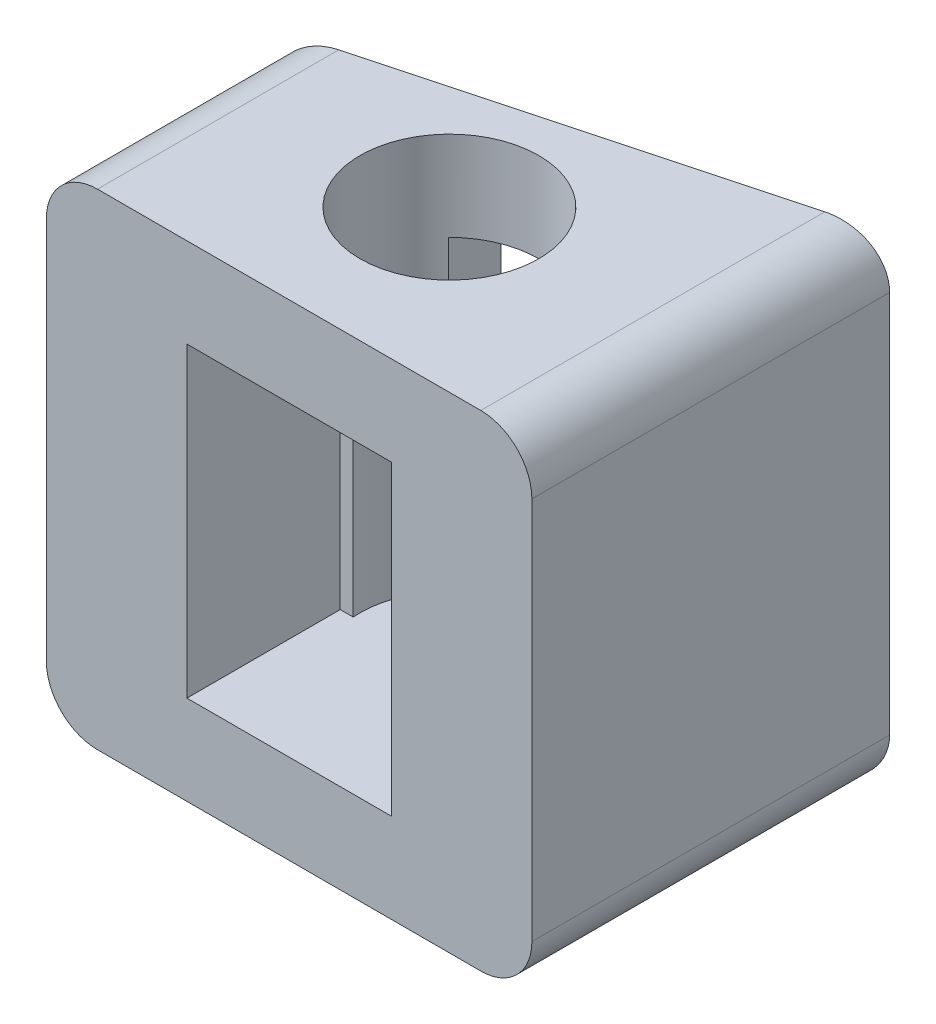
ISO-10303-21;
HEADER;
FILE_DESCRIPTION(('STEP AP214'),'2;1');
FILE_NAME('part.step','',(''),(''),'','','');
FILE_SCHEMA(('AUTOMOTIVE_DESIGN { 1 0 10303 214 1 1 1 1 }'));
ENDSEC;
DATA;
#1=APPLICATION_CONTEXT('core data for automotive mechanical design processes');
#2=APPLICATION_PROTOCOL_DEFINITION('international standard','automotive_design',2000,#1);
#3=PRODUCT_CONTEXT('',#1,'mechanical');
#4=PRODUCT('Part','Part','',(#3));
#5=PRODUCT_RELATED_PRODUCT_CATEGORY('part','',(#4));
#6=PRODUCT_DEFINITION_FORMATION('','',#4);
#7=PRODUCT_DEFINITION_CONTEXT('part definition',#1,'design');
#8=PRODUCT_DEFINITION('design','',#6,#7);
#9=PRODUCT_DEFINITION_SHAPE('','',#8);
#10=(LENGTH_UNIT() NAMED_UNIT(*) SI_UNIT(.MILLI.,.METRE.));
#11=(NAMED_UNIT(*) PLANE_ANGLE_UNIT() SI_UNIT($,.RADIAN.));
#12=(NAMED_UNIT(*) SI_UNIT($,.STERADIAN.) SOLID_ANGLE_UNIT());
#13=UNCERTAINTY_MEASURE_WITH_UNIT(LENGTH_MEASURE(1.E-05),#10,'distance_accuracy_value','');
#14=(GEOMETRIC_REPRESENTATION_CONTEXT(3) GLOBAL_UNCERTAINTY_ASSIGNED_CONTEXT((#13)) GLOBAL_UNIT_ASSIGNED_CONTEXT((#10,
#11,#12)) REPRESENTATION_CONTEXT('',''));
#15=CARTESIAN_POINT('',(0.,0.,0.));
#16=DIRECTION('',(0.,0.,1.));
#17=DIRECTION('',(1.,0.,0.));
#18=AXIS2_PLACEMENT_3D('',#15,#16,#17);
#19=CARTESIAN_POINT('',(1.25,3.,0.));
#20=DIRECTION('',(0.,1.,0.));
#21=DIRECTION('',(-1.,0.,0.));
#22=AXIS2_PLACEMENT_3D('',#19,#20,#21);
#23=PLANE('',#22);
#24=DIRECTION('',(-1.,0.,0.));
#25=VECTOR('',#24,1.);
#26=CARTESIAN_POINT('',(1.25,3.,7.));
#27=LINE('',#26,#25);
#28=CARTESIAN_POINT('',(2.,3.,7.));
#29=VERTEX_POINT('',#28);
#30=CARTESIAN_POINT('',(-2.,3.,7.));
#31=VERTEX_POINT('',#30);
#32=EDGE_CURVE('E235',#29,#31,#27,.T.);
#33=ORIENTED_EDGE('',*,*,#32,.T.);
#34=DIRECTION('',(0.,0.,1.));
#35=VECTOR('',#34,1.);
#36=CARTESIAN_POINT('',(-2.,3.,4.));
#37=LINE('',#36,#35);
#38=CARTESIAN_POINT('',(-2.,3.,4.));
#39=VERTEX_POINT('',#38);
#40=EDGE_CURVE('E176',#39,#31,#37,.T.);
#41=ORIENTED_EDGE('',*,*,#40,.F.);
#42=DIRECTION('',(-1.,0.,0.));
#43=VECTOR('',#42,1.);
#44=CARTESIAN_POINT('',(-2.,3.,4.));
#45=LINE('',#44,#43);
#46=CARTESIAN_POINT('',(-1.74675044883848,3.,4.));
#47=VERTEX_POINT('',#46);
#48=EDGE_CURVE('E183',#47,#39,#45,.T.);
#49=ORIENTED_EDGE('',*,*,#48,.F.);
#50=CARTESIAN_POINT('',(-0.00223587355044959,3.,3.86154821558523));
#51=DIRECTION('',(0.,1.,0.));
#52=DIRECTION('',(-1.,0.,0.));
#53=AXIS2_PLACEMENT_3D('',#50,#51,#52);
#54=CIRCLE('',#53,1.75);
#55=CARTESIAN_POINT('',(1.74227870173758,3.,4.));
#56=VERTEX_POINT('',#55);
#57=EDGE_CURVE('E55',#47,#56,#54,.T.);
#58=ORIENTED_EDGE('',*,*,#57,.T.);
#59=CARTESIAN_POINT('',(2.,3.,4.));
#60=VERTEX_POINT('',#59);
#61=EDGE_CURVE('E178',#60,#56,#45,.T.);
#62=ORIENTED_EDGE('',*,*,#61,.F.);
#63=DIRECTION('',(0.,0.,1.));
#64=VECTOR('',#63,1.);
#65=CARTESIAN_POINT('',(2.,3.,4.));
#66=LINE('',#65,#64);
#67=EDGE_CURVE('E168',#60,#29,#66,.T.);
#68=ORIENTED_EDGE('',*,*,#67,.T.);
#69=EDGE_LOOP('',(#33,#41,#49,#58,#62,#68));
#70=FACE_BOUND('',#69,.T.);
#71=ADVANCED_FACE('F39',(#70),#23,.F.);
#72=CARTESIAN_POINT('',(1.25,-3.,0.));
#73=DIRECTION('',(1.,0.,0.));
#74=DIRECTION('',(0.,1.,0.));
#75=AXIS2_PLACEMENT_3D('',#72,#73,#74);
#76=PLANE('',#75);
#77=DIRECTION('',(0.,0.,1.));
#78=VECTOR('',#77,1.);
#79=CARTESIAN_POINT('',(1.25,-3.,0.));
#80=LINE('',#79,#78);
#81=CARTESIAN_POINT('',(1.25,-3.,0.937822173508906));
#82=VERTEX_POINT('',#81);
#83=CARTESIAN_POINT('',(1.25,-3.,2.63908949767556));
#84=VERTEX_POINT('',#83);
#85=EDGE_CURVE('E248',#82,#84,#80,.T.);
#86=ORIENTED_EDGE('',*,*,#85,.T.);
#87=DIRECTION('',(0.,1.,0.));
#88=VECTOR('',#87,1.);
#89=CARTESIAN_POINT('',(1.25,-7.94974746830584,2.63908949767556));
#90=LINE('',#89,#88);
#91=CARTESIAN_POINT('',(1.25,3.,2.63908949767556));
#92=VERTEX_POINT('',#91);
#93=EDGE_CURVE('E223',#84,#92,#90,.T.);
#94=ORIENTED_EDGE('',*,*,#93,.T.);
#95=DIRECTION('',(0.,0.,1.));
#96=VECTOR('',#95,1.);
#97=CARTESIAN_POINT('',(1.25,3.,0.));
#98=LINE('',#97,#96);
#99=CARTESIAN_POINT('',(1.25,3.,0.937822173508905));
#100=VERTEX_POINT('',#99);
#101=EDGE_CURVE('E244',#100,#92,#98,.T.);
#102=ORIENTED_EDGE('',*,*,#101,.F.);
#103=DIRECTION('',(0.,1.,0.));
#104=VECTOR('',#103,1.);
#105=CARTESIAN_POINT('',(1.25,-5.,0.937822173508905));
#106=LINE('',#105,#104);
#107=EDGE_CURVE('E258',#82,#100,#106,.T.);
#108=ORIENTED_EDGE('',*,*,#107,.F.);
#109=EDGE_LOOP('',(#86,#94,#102,#108));
#110=FACE_BOUND('',#109,.T.);
#111=ADVANCED_FACE('F383',(#110),#76,.F.);
#112=CARTESIAN_POINT('',(3.75,3.75,10.));
#113=DIRECTION('',(0.,0.,-1.));
#114=DIRECTION('',(-1.,0.,0.));
#115=AXIS2_PLACEMENT_3D('',#112,#113,#114);
#116=CYLINDRICAL_SURFACE('',#115,1.);
#117=DIRECTION('',(0.,0.,-1.));
#118=VECTOR('',#117,1.);
#119=CARTESIAN_POINT('',(3.74999999999999,4.75,10.));
#120=LINE('',#119,#118);
#121=CARTESIAN_POINT('',(3.74999999999999,4.75,7.));
#122=VERTEX_POINT('',#121);
#123=CARTESIAN_POINT('',(3.74999999999999,4.75,0.267949192431118));
#124=VERTEX_POINT('',#123);
#125=EDGE_CURVE('E353',#122,#124,#120,.T.);
#126=ORIENTED_EDGE('',*,*,#125,.F.);
#127=CARTESIAN_POINT('',(3.75,3.75,7.));
#128=DIRECTION('',(0.,0.,-1.));
#129=DIRECTION('',(-1.,0.,0.));
#130=AXIS2_PLACEMENT_3D('',#127,#128,#129);
#131=CIRCLE('',#130,1.);
#132=CARTESIAN_POINT('',(4.75,3.74999999999999,7.));
#133=VERTEX_POINT('',#132);
#134=EDGE_CURVE('E296',#122,#133,#131,.T.);
#135=ORIENTED_EDGE('',*,*,#134,.T.);
#136=DIRECTION('',(0.,0.,-1.));
#137=VECTOR('',#136,1.);
#138=CARTESIAN_POINT('',(4.75,3.74999999999999,10.));
#139=LINE('',#138,#137);
#140=CARTESIAN_POINT('',(4.75,3.74999999999999,0.));
#141=VERTEX_POINT('',#140);
#142=EDGE_CURVE('E332',#133,#141,#139,.T.);
#143=ORIENTED_EDGE('',*,*,#142,.T.);
#144=CARTESIAN_POINT('',(3.75,3.75,0.267949192431116));
#145=DIRECTION('',(0.258819045102515,0.,0.96592582628907));
#146=DIRECTION('',(0.96592582628907,0.,-0.258819045102515));
#147=AXIS2_PLACEMENT_3D('',#144,#145,#146);
#148=ELLIPSE('',#147,1.03527618041008,1.);
#149=EDGE_CURVE('E324',#141,#124,#148,.T.);
#150=ORIENTED_EDGE('',*,*,#149,.T.);
#151=EDGE_LOOP('',(#126,#135,#143,#150));
#152=FACE_BOUND('',#151,.T.);
#153=ADVANCED_FACE('F41',(#152),#116,.T.);
#154=CARTESIAN_POINT('',(-3.75,4.75,10.));
#155=DIRECTION('',(0.,-1.,0.));
#156=DIRECTION('',(0.,0.,-1.));
#157=AXIS2_PLACEMENT_3D('',#154,#155,#156);
#158=PLANE('',#157);
#159=CARTESIAN_POINT('',(-0.00223587355044959,4.75,3.86154821558523));
#160=DIRECTION('',(0.,1.,0.));
#161=DIRECTION('',(0.,0.,1.));
#162=AXIS2_PLACEMENT_3D('',#159,#160,#161);
#163=CIRCLE('',#162,1.75);
#164=CARTESIAN_POINT('',(-0.00223587355044959,4.75,5.61154821558523));
#165=VERTEX_POINT('',#164);
#166=EDGE_CURVE('E206',#165,#165,#163,.T.);
#167=ORIENTED_EDGE('',*,*,#166,.F.);
#168=EDGE_LOOP('',(#167));
#169=FACE_BOUND('',#168,.T.);
#170=DIRECTION('',(0.,0.,-1.));
#171=VECTOR('',#170,1.);
#172=CARTESIAN_POINT('',(-3.75,4.75,10.));
#173=LINE('',#172,#171);
#174=CARTESIAN_POINT('',(-3.75,4.75,7.));
#175=VERTEX_POINT('',#174);
#176=CARTESIAN_POINT('',(-3.75,4.75,2.27756813566448));
#177=VERTEX_POINT('',#176);
#178=EDGE_CURVE('E350',#175,#177,#173,.T.);
#179=ORIENTED_EDGE('',*,*,#178,.F.);
#180=DIRECTION('',(-1.,0.,0.));
#181=VECTOR('',#180,1.);
#182=CARTESIAN_POINT('',(-4.75,4.75,7.));
#183=LINE('',#182,#181);
#184=EDGE_CURVE('E270',#122,#175,#183,.T.);
#185=ORIENTED_EDGE('',*,*,#184,.F.);
#186=ORIENTED_EDGE('',*,*,#125,.T.);
#187=DIRECTION('',(-0.96592582628907,0.,0.258819045102515));
#188=VECTOR('',#187,1.);
#189=CARTESIAN_POINT('',(-5.68060796608383,4.75,2.79487298107773));
#190=LINE('',#189,#188);
#191=EDGE_CURVE('E320',#124,#177,#190,.T.);
#192=ORIENTED_EDGE('',*,*,#191,.T.);
#193=EDGE_LOOP('',(#179,#185,#186,#192));
#194=FACE_BOUND('',#193,.T.);
#195=ADVANCED_FACE('F399',(#169,#194),#158,.F.);
#196=CARTESIAN_POINT('',(-3.75,3.75,10.));
#197=DIRECTION('',(0.,0.,-1.));
#198=DIRECTION('',(-1.,0.,0.));
#199=AXIS2_PLACEMENT_3D('',#196,#197,#198);
#200=CYLINDRICAL_SURFACE('',#199,1.);
#201=DIRECTION('',(0.,0.,-1.));
#202=VECTOR('',#201,1.);
#203=CARTESIAN_POINT('',(-4.75,3.74999999999999,10.));
#204=LINE('',#203,#202);
#205=CARTESIAN_POINT('',(-4.75,3.74999999999999,7.));
#206=VERTEX_POINT('',#205);
#207=CARTESIAN_POINT('',(-4.75,3.74999999999999,2.5455173280956));
#208=VERTEX_POINT('',#207);
#209=EDGE_CURVE('E347',#206,#208,#204,.T.);
#210=ORIENTED_EDGE('',*,*,#209,.F.);
#211=CARTESIAN_POINT('',(-3.75,3.75,7.));
#212=DIRECTION('',(0.,0.,-1.));
#213=DIRECTION('',(-1.,0.,0.));
#214=AXIS2_PLACEMENT_3D('',#211,#212,#213);
#215=CIRCLE('',#214,1.);
#216=EDGE_CURVE('E292',#206,#175,#215,.T.);
#217=ORIENTED_EDGE('',*,*,#216,.T.);
#218=ORIENTED_EDGE('',*,*,#178,.T.);
#219=CARTESIAN_POINT('',(-3.75,3.75,2.27756813566449));
#220=DIRECTION('',(0.258819045102515,0.,0.96592582628907));
#221=DIRECTION('',(0.96592582628907,0.,-0.258819045102515));
#222=AXIS2_PLACEMENT_3D('',#219,#220,#221);
#223=ELLIPSE('',#222,1.03527618041008,1.);
#224=EDGE_CURVE('E316',#177,#208,#223,.T.);
#225=ORIENTED_EDGE('',*,*,#224,.T.);
#226=EDGE_LOOP('',(#210,#217,#218,#225));
#227=FACE_BOUND('',#226,.T.);
#228=ADVANCED_FACE('F397',(#227),#200,.T.);
#229=CARTESIAN_POINT('',(-4.75,3.74999999999999,10.));
#230=DIRECTION('',(1.,0.,0.));
#231=DIRECTION('',(0.,1.,0.));
#232=AXIS2_PLACEMENT_3D('',#229,#230,#231);
#233=PLANE('',#232);
#234=DIRECTION('',(0.,0.,-1.));
#235=VECTOR('',#234,1.);
#236=CARTESIAN_POINT('',(-4.75,-3.74999999999999,10.));
#237=LINE('',#236,#235);
#238=CARTESIAN_POINT('',(-4.75,-3.75,7.));
#239=VERTEX_POINT('',#238);
#240=CARTESIAN_POINT('',(-4.75,-3.75,2.5455173280956));
#241=VERTEX_POINT('',#240);
#242=EDGE_CURVE('E344',#239,#241,#237,.T.);
#243=ORIENTED_EDGE('',*,*,#242,.F.);
#244=DIRECTION('',(0.,1.,0.));
#245=VECTOR('',#244,1.);
#246=CARTESIAN_POINT('',(-4.75,-4.75,7.));
#247=LINE('',#246,#245);
#248=EDGE_CURVE('E278',#239,#206,#247,.T.);
#249=ORIENTED_EDGE('',*,*,#248,.T.);
#250=ORIENTED_EDGE('',*,*,#209,.T.);
#251=DIRECTION('',(0.,1.,0.));
#252=VECTOR('',#251,1.);
#253=CARTESIAN_POINT('',(-4.75,-5.,2.5455173280956));
#254=LINE('',#253,#252);
#255=EDGE_CURVE('E300',#241,#208,#254,.T.);
#256=ORIENTED_EDGE('',*,*,#255,.F.);
#257=EDGE_LOOP('',(#243,#249,#250,#256));
#258=FACE_BOUND('',#257,.T.);
#259=ADVANCED_FACE('F423',(#258),#233,.F.);
#260=CARTESIAN_POINT('',(-3.75,-3.75,10.));
#261=DIRECTION('',(0.,0.,-1.));
#262=DIRECTION('',(-1.,0.,0.));
#263=AXIS2_PLACEMENT_3D('',#260,#261,#262);
#264=CYLINDRICAL_SURFACE('',#263,1.);
#265=DIRECTION('',(0.,0.,-1.));
#266=VECTOR('',#265,1.);
#267=CARTESIAN_POINT('',(-3.74999999999999,-4.75,10.));
#268=LINE('',#267,#266);
#269=CARTESIAN_POINT('',(-3.74999999999999,-4.75,7.));
#270=VERTEX_POINT('',#269);
#271=CARTESIAN_POINT('',(-3.74999999999999,-4.75,2.27756813566448));
#272=VERTEX_POINT('',#271);
#273=EDGE_CURVE('E341',#270,#272,#268,.T.);
#274=ORIENTED_EDGE('',*,*,#273,.F.);
#275=CARTESIAN_POINT('',(-3.75,-3.75,7.));
#276=DIRECTION('',(0.,0.,-1.));
#277=DIRECTION('',(-1.,0.,0.));
#278=AXIS2_PLACEMENT_3D('',#275,#276,#277);
#279=CIRCLE('',#278,1.);
#280=EDGE_CURVE('E288',#270,#239,#279,.T.);
#281=ORIENTED_EDGE('',*,*,#280,.T.);
#282=ORIENTED_EDGE('',*,*,#242,.T.);
#283=CARTESIAN_POINT('',(-3.75,-3.75,2.27756813566449));
#284=DIRECTION('',(0.258819045102515,0.,0.96592582628907));
#285=DIRECTION('',(0.96592582628907,0.,-0.258819045102515));
#286=AXIS2_PLACEMENT_3D('',#283,#284,#285);
#287=ELLIPSE('',#286,1.03527618041008,1.);
#288=EDGE_CURVE('E312',#241,#272,#287,.T.);
#289=ORIENTED_EDGE('',*,*,#288,.T.);
#290=EDGE_LOOP('',(#274,#281,#282,#289));
#291=FACE_BOUND('',#290,.T.);
#292=ADVANCED_FACE('F420',(#291),#264,.T.);
#293=CARTESIAN_POINT('',(-3.74999999999999,-4.75,10.));
#294=DIRECTION('',(0.,1.,0.));
#295=DIRECTION('',(0.,0.,1.));
#296=AXIS2_PLACEMENT_3D('',#293,#294,#295);
#297=PLANE('',#296);
#298=DIRECTION('',(0.,0.,-1.));
#299=VECTOR('',#298,1.);
#300=CARTESIAN_POINT('',(3.74999999999999,-4.75,10.));
#301=LINE('',#300,#299);
#302=CARTESIAN_POINT('',(3.75,-4.75,7.));
#303=VERTEX_POINT('',#302);
#304=CARTESIAN_POINT('',(3.74999999999999,-4.75,0.267949192431118));
#305=VERTEX_POINT('',#304);
#306=EDGE_CURVE('E338',#303,#305,#301,.T.);
#307=ORIENTED_EDGE('',*,*,#306,.F.);
#308=DIRECTION('',(-1.,0.,0.));
#309=VECTOR('',#308,1.);
#310=CARTESIAN_POINT('',(-4.75,-4.75,7.));
#311=LINE('',#310,#309);
#312=EDGE_CURVE('E271',#303,#270,#311,.T.);
#313=ORIENTED_EDGE('',*,*,#312,.T.);
#314=ORIENTED_EDGE('',*,*,#273,.T.);
#315=DIRECTION('',(0.96592582628907,0.,-0.258819045102515));
#316=VECTOR('',#315,1.);
#317=CARTESIAN_POINT('',(-5.68060796608383,-4.75,2.79487298107773));
#318=LINE('',#317,#316);
#319=EDGE_CURVE('E308',#272,#305,#318,.T.);
#320=ORIENTED_EDGE('',*,*,#319,.T.);
#321=EDGE_LOOP('',(#307,#313,#314,#320));
#322=FACE_BOUND('',#321,.T.);
#323=ADVANCED_FACE('F415',(#322),#297,.F.);
#324=CARTESIAN_POINT('',(3.75,-3.75,10.));
#325=DIRECTION('',(0.,0.,-1.));
#326=DIRECTION('',(-1.,0.,0.));
#327=AXIS2_PLACEMENT_3D('',#324,#325,#326);
#328=CYLINDRICAL_SURFACE('',#327,1.);
#329=DIRECTION('',(0.,0.,-1.));
#330=VECTOR('',#329,1.);
#331=CARTESIAN_POINT('',(4.75,-3.74999999999999,10.));
#332=LINE('',#331,#330);
#333=CARTESIAN_POINT('',(4.75,-3.74999999999999,7.));
#334=VERTEX_POINT('',#333);
#335=CARTESIAN_POINT('',(4.75,-3.74999999999999,0.));
#336=VERTEX_POINT('',#335);
#337=EDGE_CURVE('E335',#334,#336,#332,.T.);
#338=ORIENTED_EDGE('',*,*,#337,.F.);
#339=CARTESIAN_POINT('',(3.75,-3.75,7.));
#340=DIRECTION('',(0.,0.,-1.));
#341=DIRECTION('',(-1.,0.,0.));
#342=AXIS2_PLACEMENT_3D('',#339,#340,#341);
#343=CIRCLE('',#342,1.);
#344=EDGE_CURVE('E282',#334,#303,#343,.T.);
#345=ORIENTED_EDGE('',*,*,#344,.T.);
#346=ORIENTED_EDGE('',*,*,#306,.T.);
#347=CARTESIAN_POINT('',(3.75,-3.75,0.267949192431116));
#348=DIRECTION('',(0.258819045102515,0.,0.96592582628907));
#349=DIRECTION('',(0.96592582628907,0.,-0.258819045102515));
#350=AXIS2_PLACEMENT_3D('',#347,#348,#349);
#351=ELLIPSE('',#350,1.03527618041008,1.);
#352=EDGE_CURVE('E304',#305,#336,#351,.T.);
#353=ORIENTED_EDGE('',*,*,#352,.T.);
#354=EDGE_LOOP('',(#338,#345,#346,#353));
#355=FACE_BOUND('',#354,.T.);
#356=ADVANCED_FACE('F412',(#355),#328,.T.);
#357=CARTESIAN_POINT('',(4.75,3.74999999999999,10.));
#358=DIRECTION('',(-1.,0.,0.));
#359=DIRECTION('',(0.,-1.,0.));
#360=AXIS2_PLACEMENT_3D('',#357,#358,#359);
#361=PLANE('',#360);
#362=ORIENTED_EDGE('',*,*,#142,.F.);
#363=DIRECTION('',(0.,1.,0.));
#364=VECTOR('',#363,1.);
#365=CARTESIAN_POINT('',(4.75,-4.75,7.));
#366=LINE('',#365,#364);
#367=EDGE_CURVE('E275',#334,#133,#366,.T.);
#368=ORIENTED_EDGE('',*,*,#367,.F.);
#369=ORIENTED_EDGE('',*,*,#337,.T.);
#370=DIRECTION('',(0.,1.,0.));
#371=VECTOR('',#370,1.);
#372=CARTESIAN_POINT('',(4.75,3.74999999999999,0.));
#373=LINE('',#372,#371);
#374=EDGE_CURVE('E328',#336,#141,#373,.T.);
#375=ORIENTED_EDGE('',*,*,#374,.T.);
#376=EDGE_LOOP('',(#362,#368,#369,#375));
#377=FACE_BOUND('',#376,.T.);
#378=ADVANCED_FACE('F407',(#377),#361,.F.);
#379=CARTESIAN_POINT('',(-4.75,-5.,2.5455173280956));
#380=DIRECTION('',(0.258819045102515,0.,0.96592582628907));
#381=DIRECTION('',(0.96592582628907,0.,-0.258819045102515));
#382=AXIS2_PLACEMENT_3D('',#379,#380,#381);
#383=PLANE('',#382);
#384=DIRECTION('',(-0.96592582628907,0.,0.258819045102515));
#385=VECTOR('',#384,1.);
#386=CARTESIAN_POINT('',(-4.75000000000001,3.,2.5455173280956));
#387=LINE('',#386,#385);
#388=CARTESIAN_POINT('',(-1.25,3.,1.6076951545867));
#389=VERTEX_POINT('',#388);
#390=EDGE_CURVE('E262',#100,#389,#387,.T.);
#391=ORIENTED_EDGE('',*,*,#390,.T.);
#392=DIRECTION('',(0.,-1.,0.));
#393=VECTOR('',#392,1.);
#394=CARTESIAN_POINT('',(-1.25,-5.,1.6076951545867));
#395=LINE('',#394,#393);
#396=CARTESIAN_POINT('',(-1.25,-3.,1.6076951545867));
#397=VERTEX_POINT('',#396);
#398=EDGE_CURVE('E266',#389,#397,#395,.T.);
#399=ORIENTED_EDGE('',*,*,#398,.T.);
#400=DIRECTION('',(0.96592582628907,0.,-0.258819045102515));
#401=VECTOR('',#400,1.);
#402=CARTESIAN_POINT('',(-4.75,-3.,2.5455173280956));
#403=LINE('',#402,#401);
#404=EDGE_CURVE('E243',#397,#82,#403,.T.);
#405=ORIENTED_EDGE('',*,*,#404,.T.);
#406=ORIENTED_EDGE('',*,*,#107,.T.);
#407=EDGE_LOOP('',(#391,#399,#405,#406));
#408=FACE_BOUND('',#407,.T.);
#409=ORIENTED_EDGE('',*,*,#374,.F.);
#410=ORIENTED_EDGE('',*,*,#352,.F.);
#411=ORIENTED_EDGE('',*,*,#319,.F.);
#412=ORIENTED_EDGE('',*,*,#288,.F.);
#413=ORIENTED_EDGE('',*,*,#255,.T.);
#414=ORIENTED_EDGE('',*,*,#224,.F.);
#415=ORIENTED_EDGE('',*,*,#191,.F.);
#416=ORIENTED_EDGE('',*,*,#149,.F.);
#417=EDGE_LOOP('',(#409,#410,#411,#412,#413,#414,#415,#416));
#418=FACE_BOUND('',#417,.T.);
#419=ADVANCED_FACE('F379',(#408,#418),#383,.F.);
#420=CARTESIAN_POINT('',(-4.75,-4.75,7.));
#421=DIRECTION('',(0.,0.,-1.));
#422=DIRECTION('',(-1.,0.,0.));
#423=AXIS2_PLACEMENT_3D('',#420,#421,#422);
#424=PLANE('',#423);
#425=DIRECTION('',(1.,0.,0.));
#426=VECTOR('',#425,1.);
#427=CARTESIAN_POINT('',(1.25,-3.,7.));
#428=LINE('',#427,#426);
#429=CARTESIAN_POINT('',(-2.,-3.,7.));
#430=VERTEX_POINT('',#429);
#431=CARTESIAN_POINT('',(2.,-3.,7.));
#432=VERTEX_POINT('',#431);
#433=EDGE_CURVE('E232',#430,#432,#428,.T.);
#434=ORIENTED_EDGE('',*,*,#433,.F.);
#435=DIRECTION('',(0.,-1.,0.));
#436=VECTOR('',#435,1.);
#437=CARTESIAN_POINT('',(-2.,3.,7.));
#438=LINE('',#437,#436);
#439=EDGE_CURVE('E190',#31,#430,#438,.T.);
#440=ORIENTED_EDGE('',*,*,#439,.F.);
#441=ORIENTED_EDGE('',*,*,#32,.F.);
#442=DIRECTION('',(0.,1.,0.));
#443=VECTOR('',#442,1.);
#444=CARTESIAN_POINT('',(2.,3.,7.));
#445=LINE('',#444,#443);
#446=EDGE_CURVE('E174',#432,#29,#445,.T.);
#447=ORIENTED_EDGE('',*,*,#446,.F.);
#448=EDGE_LOOP('',(#434,#440,#441,#447));
#449=FACE_BOUND('',#448,.T.);
#450=ORIENTED_EDGE('',*,*,#184,.T.);
#451=ORIENTED_EDGE('',*,*,#216,.F.);
#452=ORIENTED_EDGE('',*,*,#248,.F.);
#453=ORIENTED_EDGE('',*,*,#280,.F.);
#454=ORIENTED_EDGE('',*,*,#312,.F.);
#455=ORIENTED_EDGE('',*,*,#344,.F.);
#456=ORIENTED_EDGE('',*,*,#367,.T.);
#457=ORIENTED_EDGE('',*,*,#134,.F.);
#458=EDGE_LOOP('',(#450,#451,#452,#453,#454,#455,#456,#457));
#459=FACE_BOUND('',#458,.T.);
#460=ADVANCED_FACE('F387',(#449,#459),#424,.F.);
#461=CARTESIAN_POINT('',(-1.25,-3.,0.));
#462=DIRECTION('',(-1.,0.,0.));
#463=DIRECTION('',(0.,0.,1.));
#464=AXIS2_PLACEMENT_3D('',#461,#462,#463);
#465=PLANE('',#464);
#466=DIRECTION('',(0.,0.,1.));
#467=VECTOR('',#466,1.);
#468=CARTESIAN_POINT('',(-1.25,3.,0.));
#469=LINE('',#468,#467);
#470=CARTESIAN_POINT('',(-1.25,3.,2.63452552437467));
#471=VERTEX_POINT('',#470);
#472=EDGE_CURVE('E239',#389,#471,#469,.T.);
#473=ORIENTED_EDGE('',*,*,#472,.T.);
#474=DIRECTION('',(0.,1.,0.));
#475=VECTOR('',#474,1.);
#476=CARTESIAN_POINT('',(-1.25,-7.94974746830584,2.63452552437467));
#477=LINE('',#476,#475);
#478=CARTESIAN_POINT('',(-1.25,-3.,2.63452552437467));
#479=VERTEX_POINT('',#478);
#480=EDGE_CURVE('E228',#471,#479,#477,.F.);
#481=ORIENTED_EDGE('',*,*,#480,.T.);
#482=DIRECTION('',(0.,0.,1.));
#483=VECTOR('',#482,1.);
#484=CARTESIAN_POINT('',(-1.25,-3.,0.));
#485=LINE('',#484,#483);
#486=EDGE_CURVE('E238',#397,#479,#485,.T.);
#487=ORIENTED_EDGE('',*,*,#486,.F.);
#488=ORIENTED_EDGE('',*,*,#398,.F.);
#489=EDGE_LOOP('',(#473,#481,#487,#488));
#490=FACE_BOUND('',#489,.T.);
#491=ADVANCED_FACE('F377',(#490),#465,.F.);
#492=ORIENTED_EDGE('',*,*,#101,.T.);
#493=EDGE_CURVE('E224',#92,#471,#54,.T.);
#494=ORIENTED_EDGE('',*,*,#493,.T.);
#495=ORIENTED_EDGE('',*,*,#472,.F.);
#496=ORIENTED_EDGE('',*,*,#390,.F.);
#497=EDGE_LOOP('',(#492,#494,#495,#496));
#498=FACE_BOUND('',#497,.T.);
#499=ADVANCED_FACE('F373',(#498),#23,.F.);
#500=CARTESIAN_POINT('',(1.25,-3.,0.));
#501=DIRECTION('',(0.,-1.,0.));
#502=DIRECTION('',(1.,0.,0.));
#503=AXIS2_PLACEMENT_3D('',#500,#501,#502);
#504=PLANE('',#503);
#505=DIRECTION('',(0.,0.,1.));
#506=VECTOR('',#505,1.);
#507=CARTESIAN_POINT('',(-2.,-3.,4.));
#508=LINE('',#507,#506);
#509=CARTESIAN_POINT('',(-2.,-3.,4.));
#510=VERTEX_POINT('',#509);
#511=EDGE_CURVE('E207',#510,#430,#508,.T.);
#512=ORIENTED_EDGE('',*,*,#511,.T.);
#513=ORIENTED_EDGE('',*,*,#433,.T.);
#514=DIRECTION('',(0.,0.,1.));
#515=VECTOR('',#514,1.);
#516=CARTESIAN_POINT('',(2.,-3.,4.));
#517=LINE('',#516,#515);
#518=CARTESIAN_POINT('',(2.,-3.,4.));
#519=VERTEX_POINT('',#518);
#520=EDGE_CURVE('E203',#519,#432,#517,.T.);
#521=ORIENTED_EDGE('',*,*,#520,.F.);
#522=DIRECTION('',(1.,0.,0.));
#523=VECTOR('',#522,1.);
#524=CARTESIAN_POINT('',(-2.,-3.,4.));
#525=LINE('',#524,#523);
#526=CARTESIAN_POINT('',(1.74227870173758,-3.,4.));
#527=VERTEX_POINT('',#526);
#528=EDGE_CURVE('E187',#527,#519,#525,.T.);
#529=ORIENTED_EDGE('',*,*,#528,.F.);
#530=CARTESIAN_POINT('',(-0.00223587355044959,-3.,3.86154821558523));
#531=DIRECTION('',(0.,-1.,0.));
#532=DIRECTION('',(1.,0.,0.));
#533=AXIS2_PLACEMENT_3D('',#530,#531,#532);
#534=CIRCLE('',#533,1.75);
#535=EDGE_CURVE('E217',#527,#84,#534,.F.);
#536=ORIENTED_EDGE('',*,*,#535,.T.);
#537=ORIENTED_EDGE('',*,*,#85,.F.);
#538=ORIENTED_EDGE('',*,*,#404,.F.);
#539=ORIENTED_EDGE('',*,*,#486,.T.);
#540=CARTESIAN_POINT('',(-1.74675044883848,-3.,4.));
#541=VERTEX_POINT('',#540);
#542=EDGE_CURVE('E220',#479,#541,#534,.F.);
#543=ORIENTED_EDGE('',*,*,#542,.T.);
#544=EDGE_CURVE('E63',#510,#541,#525,.T.);
#545=ORIENTED_EDGE('',*,*,#544,.F.);
#546=EDGE_LOOP('',(#512,#513,#521,#529,#536,#537,#538,#539,#543,#545));
#547=FACE_BOUND('',#546,.T.);
#548=ADVANCED_FACE('F365',(#547),#504,.F.);
#549=CARTESIAN_POINT('',(-0.00223587355044959,-7.94974746830584,3.86154821558523));
#550=DIRECTION('',(0.,1.,0.));
#551=DIRECTION('',(0.,0.,1.));
#552=AXIS2_PLACEMENT_3D('',#549,#550,#551);
#553=CYLINDRICAL_SURFACE('',#552,1.75);
#554=ORIENTED_EDGE('',*,*,#166,.T.);
#555=EDGE_LOOP('',(#554));
#556=FACE_BOUND('',#555,.T.);
#557=DIRECTION('',(0.,1.,0.));
#558=VECTOR('',#557,1.);
#559=CARTESIAN_POINT('',(1.74227870173758,-7.94974746830584,4.));
#560=LINE('',#559,#558);
#561=EDGE_CURVE('E11',#56,#527,#560,.F.);
#562=ORIENTED_EDGE('',*,*,#561,.F.);
#563=ORIENTED_EDGE('',*,*,#57,.F.);
#564=DIRECTION('',(0.,1.,0.));
#565=VECTOR('',#564,1.);
#566=CARTESIAN_POINT('',(-1.74675044883848,-7.94974746830584,4.));
#567=LINE('',#566,#565);
#568=EDGE_CURVE('E48',#541,#47,#567,.T.);
#569=ORIENTED_EDGE('',*,*,#568,.F.);
#570=ORIENTED_EDGE('',*,*,#542,.F.);
#571=ORIENTED_EDGE('',*,*,#480,.F.);
#572=ORIENTED_EDGE('',*,*,#493,.F.);
#573=ORIENTED_EDGE('',*,*,#93,.F.);
#574=ORIENTED_EDGE('',*,*,#535,.F.);
#575=EDGE_LOOP('',(#562,#563,#569,#570,#571,#572,#573,#574));
#576=FACE_BOUND('',#575,.T.);
#577=ADVANCED_FACE('F385',(#556,#576),#553,.F.);
#578=CARTESIAN_POINT('',(0.,0.,4.));
#579=DIRECTION('',(0.,0.,1.));
#580=DIRECTION('',(1.,0.,0.));
#581=AXIS2_PLACEMENT_3D('',#578,#579,#580);
#582=PLANE('',#581);
#583=ORIENTED_EDGE('',*,*,#568,.T.);
#584=ORIENTED_EDGE('',*,*,#48,.T.);
#585=DIRECTION('',(0.,-1.,0.));
#586=VECTOR('',#585,1.);
#587=CARTESIAN_POINT('',(-2.,3.,4.));
#588=LINE('',#587,#586);
#589=EDGE_CURVE('E182',#39,#510,#588,.T.);
#590=ORIENTED_EDGE('',*,*,#589,.T.);
#591=ORIENTED_EDGE('',*,*,#544,.T.);
#592=EDGE_LOOP('',(#583,#584,#590,#591));
#593=FACE_BOUND('',#592,.T.);
#594=ADVANCED_FACE('F356',(#593),#582,.T.);
#595=CARTESIAN_POINT('',(-2.,3.,4.));
#596=DIRECTION('',(-1.,0.,0.));
#597=DIRECTION('',(0.,0.,1.));
#598=AXIS2_PLACEMENT_3D('',#595,#596,#597);
#599=PLANE('',#598);
#600=ORIENTED_EDGE('',*,*,#439,.T.);
#601=ORIENTED_EDGE('',*,*,#511,.F.);
#602=ORIENTED_EDGE('',*,*,#589,.F.);
#603=ORIENTED_EDGE('',*,*,#40,.T.);
#604=EDGE_LOOP('',(#600,#601,#602,#603));
#605=FACE_BOUND('',#604,.T.);
#606=ADVANCED_FACE('F363',(#605),#599,.F.);
#607=ORIENTED_EDGE('',*,*,#561,.T.);
#608=ORIENTED_EDGE('',*,*,#528,.T.);
#609=DIRECTION('',(0.,1.,0.));
#610=VECTOR('',#609,1.);
#611=CARTESIAN_POINT('',(2.,3.,4.));
#612=LINE('',#611,#610);
#613=EDGE_CURVE('E172',#519,#60,#612,.T.);
#614=ORIENTED_EDGE('',*,*,#613,.T.);
#615=ORIENTED_EDGE('',*,*,#61,.T.);
#616=EDGE_LOOP('',(#607,#608,#614,#615));
#617=FACE_BOUND('',#616,.T.);
#618=ADVANCED_FACE('F185',(#617),#582,.T.);
#619=CARTESIAN_POINT('',(2.,3.,4.));
#620=DIRECTION('',(1.,0.,0.));
#621=DIRECTION('',(0.,0.,-1.));
#622=AXIS2_PLACEMENT_3D('',#619,#620,#621);
#623=PLANE('',#622);
#624=ORIENTED_EDGE('',*,*,#446,.T.);
#625=ORIENTED_EDGE('',*,*,#67,.F.);
#626=ORIENTED_EDGE('',*,*,#613,.F.);
#627=ORIENTED_EDGE('',*,*,#520,.T.);
#628=EDGE_LOOP('',(#624,#625,#626,#627));
#629=FACE_BOUND('',#628,.T.);
#630=ADVANCED_FACE('F169',(#629),#623,.F.);
#631=CLOSED_SHELL('',(#71,#111,#153,#195,#228,#259,#292,#323,#356,#378,#419,#460,#491,#499,#548,
#577,#594,#606,#618,#630));
#632=MANIFOLD_SOLID_BREP('B2',#631);
#633=ADVANCED_BREP_SHAPE_REPRESENTATION('',(#18,#632),#14);
#634=SHAPE_DEFINITION_REPRESENTATION(#9,#633);
ENDSEC;
END-ISO-10303-21;
